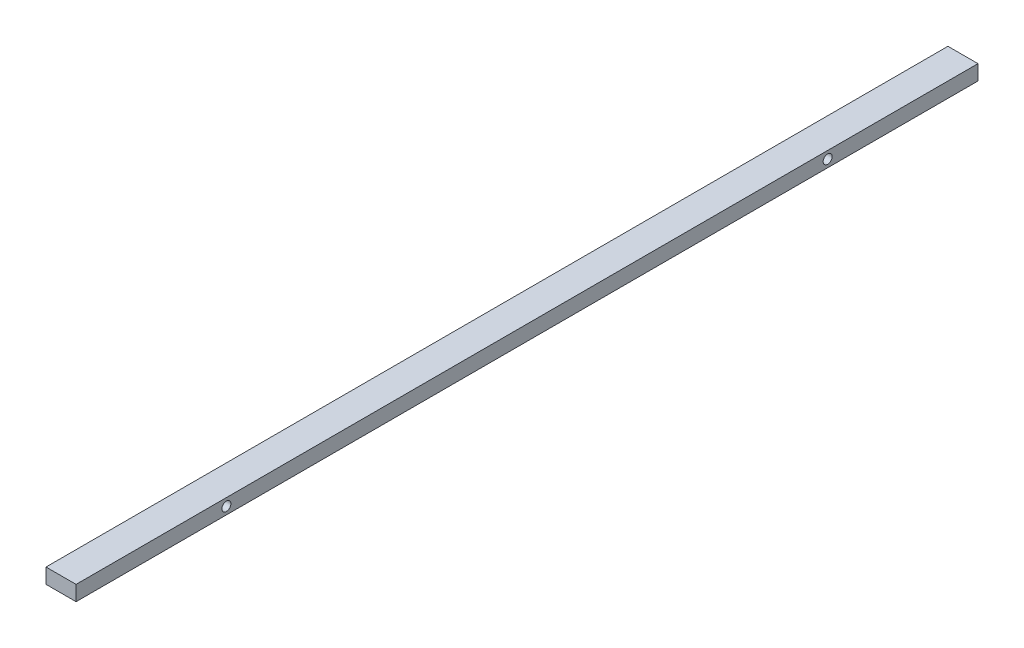
ISO-10303-21;
HEADER;
FILE_DESCRIPTION(('STEP AP214'),'2;1');
FILE_NAME('part.step','',(''),(''),'','','');
FILE_SCHEMA(('AUTOMOTIVE_DESIGN { 1 0 10303 214 1 1 1 1 }'));
ENDSEC;
DATA;
#1=APPLICATION_CONTEXT('core data for automotive mechanical design processes');
#2=APPLICATION_PROTOCOL_DEFINITION('international standard','automotive_design',2000,#1);
#3=PRODUCT_CONTEXT('',#1,'mechanical');
#4=PRODUCT('Part','Part','',(#3));
#5=PRODUCT_RELATED_PRODUCT_CATEGORY('part','',(#4));
#6=PRODUCT_DEFINITION_FORMATION('','',#4);
#7=PRODUCT_DEFINITION_CONTEXT('part definition',#1,'design');
#8=PRODUCT_DEFINITION('design','',#6,#7);
#9=PRODUCT_DEFINITION_SHAPE('','',#8);
#10=(LENGTH_UNIT() NAMED_UNIT(*) SI_UNIT(.MILLI.,.METRE.));
#11=(NAMED_UNIT(*) PLANE_ANGLE_UNIT() SI_UNIT($,.RADIAN.));
#12=(NAMED_UNIT(*) SI_UNIT($,.STERADIAN.) SOLID_ANGLE_UNIT());
#13=UNCERTAINTY_MEASURE_WITH_UNIT(LENGTH_MEASURE(1.E-05),#10,'distance_accuracy_value','');
#14=(GEOMETRIC_REPRESENTATION_CONTEXT(3) GLOBAL_UNCERTAINTY_ASSIGNED_CONTEXT((#13)) GLOBAL_UNIT_ASSIGNED_CONTEXT((#10,
#11,#12)) REPRESENTATION_CONTEXT('',''));
#15=CARTESIAN_POINT('',(0.,0.,0.));
#16=DIRECTION('',(0.,0.,1.));
#17=DIRECTION('',(1.,0.,0.));
#18=AXIS2_PLACEMENT_3D('',#15,#16,#17);
#19=CARTESIAN_POINT('',(-4.76793248945147,0.379746835443036,300.));
#20=DIRECTION('',(1.,0.,0.));
#21=DIRECTION('',(0.,1.,0.));
#22=AXIS2_PLACEMENT_3D('',#19,#20,#21);
#23=PLANE('',#22);
#24=CARTESIAN_POINT('',(-4.76793248945147,-2.12025316455696,50.));
#25=DIRECTION('',(1.,0.,0.));
#26=DIRECTION('',(0.,1.,0.));
#27=AXIS2_PLACEMENT_3D('',#24,#25,#26);
#28=CIRCLE('',#27,1.5);
#29=CARTESIAN_POINT('',(-4.76793248945147,-0.62025316455696,50.));
#30=VERTEX_POINT('',#29);
#31=EDGE_CURVE('E99',#30,#30,#28,.T.);
#32=ORIENTED_EDGE('',*,*,#31,.T.);
#33=EDGE_LOOP('',(#32));
#34=FACE_BOUND('',#33,.T.);
#35=CARTESIAN_POINT('',(-4.76793248945147,-2.12025316455697,250.));
#36=DIRECTION('',(1.,0.,0.));
#37=DIRECTION('',(0.,1.,0.));
#38=AXIS2_PLACEMENT_3D('',#35,#36,#37);
#39=CIRCLE('',#38,1.50000000000002);
#40=CARTESIAN_POINT('',(-4.76793248945147,-0.620253164556946,250.));
#41=VERTEX_POINT('',#40);
#42=EDGE_CURVE('E112',#41,#41,#39,.T.);
#43=ORIENTED_EDGE('',*,*,#42,.T.);
#44=EDGE_LOOP('',(#43));
#45=FACE_BOUND('',#44,.T.);
#46=DIRECTION('',(0.,-1.,0.));
#47=VECTOR('',#46,1.);
#48=CARTESIAN_POINT('',(-4.76793248945147,0.379746835443036,0.));
#49=LINE('',#48,#47);
#50=CARTESIAN_POINT('',(-4.76793248945147,0.379746835443036,0.));
#51=VERTEX_POINT('',#50);
#52=CARTESIAN_POINT('',(-4.76793248945147,-4.62025316455696,0.));
#53=VERTEX_POINT('',#52);
#54=EDGE_CURVE('E96',#51,#53,#49,.T.);
#55=ORIENTED_EDGE('',*,*,#54,.T.);
#56=DIRECTION('',(0.,0.,-1.));
#57=VECTOR('',#56,1.);
#58=CARTESIAN_POINT('',(-4.76793248945147,-4.62025316455696,300.));
#59=LINE('',#58,#57);
#60=CARTESIAN_POINT('',(-4.76793248945147,-4.62025316455696,300.));
#61=VERTEX_POINT('',#60);
#62=EDGE_CURVE('E11',#61,#53,#59,.T.);
#63=ORIENTED_EDGE('',*,*,#62,.F.);
#64=DIRECTION('',(0.,-1.,0.));
#65=VECTOR('',#64,1.);
#66=CARTESIAN_POINT('',(-4.76793248945147,0.379746835443036,300.));
#67=LINE('',#66,#65);
#68=CARTESIAN_POINT('',(-4.76793248945147,0.379746835443036,300.));
#69=VERTEX_POINT('',#68);
#70=EDGE_CURVE('E84',#69,#61,#67,.T.);
#71=ORIENTED_EDGE('',*,*,#70,.F.);
#72=DIRECTION('',(0.,0.,-1.));
#73=VECTOR('',#72,1.);
#74=CARTESIAN_POINT('',(-4.76793248945147,0.379746835443036,300.));
#75=LINE('',#74,#73);
#76=EDGE_CURVE('E92',#69,#51,#75,.T.);
#77=ORIENTED_EDGE('',*,*,#76,.T.);
#78=EDGE_LOOP('',(#55,#63,#71,#77));
#79=FACE_BOUND('',#78,.T.);
#80=ADVANCED_FACE('F33',(#34,#45,#79),#23,.F.);
#81=CARTESIAN_POINT('',(-4.76793248945147,-4.62025316455696,300.));
#82=DIRECTION('',(0.,1.,0.));
#83=DIRECTION('',(0.,0.,1.));
#84=AXIS2_PLACEMENT_3D('',#81,#82,#83);
#85=PLANE('',#84);
#86=DIRECTION('',(1.,0.,0.));
#87=VECTOR('',#86,1.);
#88=CARTESIAN_POINT('',(-4.76793248945147,-4.62025316455696,0.));
#89=LINE('',#88,#87);
#90=CARTESIAN_POINT('',(5.23206751054853,-4.62025316455696,0.));
#91=VERTEX_POINT('',#90);
#92=EDGE_CURVE('E88',#53,#91,#89,.T.);
#93=ORIENTED_EDGE('',*,*,#92,.T.);
#94=DIRECTION('',(0.,0.,-1.));
#95=VECTOR('',#94,1.);
#96=CARTESIAN_POINT('',(5.23206751054853,-4.62025316455696,300.));
#97=LINE('',#96,#95);
#98=CARTESIAN_POINT('',(5.23206751054853,-4.62025316455696,300.));
#99=VERTEX_POINT('',#98);
#100=EDGE_CURVE('E41',#99,#91,#97,.T.);
#101=ORIENTED_EDGE('',*,*,#100,.F.);
#102=DIRECTION('',(1.,0.,0.));
#103=VECTOR('',#102,1.);
#104=CARTESIAN_POINT('',(-4.76793248945147,-4.62025316455696,300.));
#105=LINE('',#104,#103);
#106=EDGE_CURVE('E79',#61,#99,#105,.T.);
#107=ORIENTED_EDGE('',*,*,#106,.F.);
#108=ORIENTED_EDGE('',*,*,#62,.T.);
#109=EDGE_LOOP('',(#93,#101,#107,#108));
#110=FACE_BOUND('',#109,.T.);
#111=ADVANCED_FACE('F87',(#110),#85,.F.);
#112=CARTESIAN_POINT('',(5.23206751054853,0.379746835443036,300.));
#113=DIRECTION('',(-1.,0.,0.));
#114=DIRECTION('',(0.,-1.,0.));
#115=AXIS2_PLACEMENT_3D('',#112,#113,#114);
#116=PLANE('',#115);
#117=CARTESIAN_POINT('',(5.23206751054853,-2.12025316455696,50.));
#118=DIRECTION('',(-1.,0.,0.));
#119=DIRECTION('',(0.,-1.,0.));
#120=AXIS2_PLACEMENT_3D('',#117,#118,#119);
#121=CIRCLE('',#120,1.5);
#122=CARTESIAN_POINT('',(5.23206751054853,-3.62025316455696,50.));
#123=VERTEX_POINT('',#122);
#124=EDGE_CURVE('E115',#123,#123,#121,.T.);
#125=ORIENTED_EDGE('',*,*,#124,.T.);
#126=EDGE_LOOP('',(#125));
#127=FACE_BOUND('',#126,.T.);
#128=CARTESIAN_POINT('',(5.23206751054853,-2.12025316455697,250.));
#129=DIRECTION('',(-1.,0.,0.));
#130=DIRECTION('',(0.,-1.,0.));
#131=AXIS2_PLACEMENT_3D('',#128,#129,#130);
#132=CIRCLE('',#131,1.50000000000002);
#133=CARTESIAN_POINT('',(5.23206751054853,-3.62025316455699,250.));
#134=VERTEX_POINT('',#133);
#135=EDGE_CURVE('E116',#134,#134,#132,.T.);
#136=ORIENTED_EDGE('',*,*,#135,.T.);
#137=EDGE_LOOP('',(#136));
#138=FACE_BOUND('',#137,.T.);
#139=DIRECTION('',(0.,1.,0.));
#140=VECTOR('',#139,1.);
#141=CARTESIAN_POINT('',(5.23206751054853,0.379746835443036,0.));
#142=LINE('',#141,#140);
#143=CARTESIAN_POINT('',(5.23206751054853,0.379746835443036,0.));
#144=VERTEX_POINT('',#143);
#145=EDGE_CURVE('E66',#91,#144,#142,.T.);
#146=ORIENTED_EDGE('',*,*,#145,.T.);
#147=DIRECTION('',(0.,0.,-1.));
#148=VECTOR('',#147,1.);
#149=CARTESIAN_POINT('',(5.23206751054853,0.379746835443036,300.));
#150=LINE('',#149,#148);
#151=CARTESIAN_POINT('',(5.23206751054853,0.379746835443036,300.));
#152=VERTEX_POINT('',#151);
#153=EDGE_CURVE('E89',#152,#144,#150,.T.);
#154=ORIENTED_EDGE('',*,*,#153,.F.);
#155=DIRECTION('',(0.,1.,0.));
#156=VECTOR('',#155,1.);
#157=CARTESIAN_POINT('',(5.23206751054853,0.379746835443036,300.));
#158=LINE('',#157,#156);
#159=EDGE_CURVE('E82',#99,#152,#158,.T.);
#160=ORIENTED_EDGE('',*,*,#159,.F.);
#161=ORIENTED_EDGE('',*,*,#100,.T.);
#162=EDGE_LOOP('',(#146,#154,#160,#161));
#163=FACE_BOUND('',#162,.T.);
#164=ADVANCED_FACE('F90',(#127,#138,#163),#116,.F.);
#165=CARTESIAN_POINT('',(-4.76793248945147,0.379746835443036,300.));
#166=DIRECTION('',(0.,-1.,0.));
#167=DIRECTION('',(0.,0.,-1.));
#168=AXIS2_PLACEMENT_3D('',#165,#166,#167);
#169=PLANE('',#168);
#170=DIRECTION('',(-1.,0.,0.));
#171=VECTOR('',#170,1.);
#172=CARTESIAN_POINT('',(-4.76793248945147,0.379746835443036,0.));
#173=LINE('',#172,#171);
#174=EDGE_CURVE('E72',#144,#51,#173,.T.);
#175=ORIENTED_EDGE('',*,*,#174,.T.);
#176=ORIENTED_EDGE('',*,*,#76,.F.);
#177=DIRECTION('',(-1.,0.,0.));
#178=VECTOR('',#177,1.);
#179=CARTESIAN_POINT('',(-4.76793248945147,0.379746835443036,300.));
#180=LINE('',#179,#178);
#181=EDGE_CURVE('E49',#152,#69,#180,.T.);
#182=ORIENTED_EDGE('',*,*,#181,.F.);
#183=ORIENTED_EDGE('',*,*,#153,.T.);
#184=EDGE_LOOP('',(#175,#176,#182,#183));
#185=FACE_BOUND('',#184,.T.);
#186=ADVANCED_FACE('F104',(#185),#169,.F.);
#187=CARTESIAN_POINT('',(0.,0.,300.));
#188=DIRECTION('',(0.,0.,1.));
#189=DIRECTION('',(1.,0.,0.));
#190=AXIS2_PLACEMENT_3D('',#187,#188,#189);
#191=PLANE('',#190);
#192=ORIENTED_EDGE('',*,*,#70,.T.);
#193=ORIENTED_EDGE('',*,*,#106,.T.);
#194=ORIENTED_EDGE('',*,*,#159,.T.);
#195=ORIENTED_EDGE('',*,*,#181,.T.);
#196=EDGE_LOOP('',(#192,#193,#194,#195));
#197=FACE_BOUND('',#196,.T.);
#198=ADVANCED_FACE('F80',(#197),#191,.T.);
#199=CARTESIAN_POINT('',(0.,0.,0.));
#200=DIRECTION('',(0.,0.,1.));
#201=DIRECTION('',(1.,0.,0.));
#202=AXIS2_PLACEMENT_3D('',#199,#200,#201);
#203=PLANE('',#202);
#204=ORIENTED_EDGE('',*,*,#54,.F.);
#205=ORIENTED_EDGE('',*,*,#174,.F.);
#206=ORIENTED_EDGE('',*,*,#145,.F.);
#207=ORIENTED_EDGE('',*,*,#92,.F.);
#208=EDGE_LOOP('',(#204,#205,#206,#207));
#209=FACE_BOUND('',#208,.T.);
#210=ADVANCED_FACE('F107',(#209),#203,.F.);
#211=CARTESIAN_POINT('',(5.23206751054853,-2.12025316455697,250.));
#212=DIRECTION('',(-1.,0.,0.));
#213=DIRECTION('',(0.,-1.,0.));
#214=AXIS2_PLACEMENT_3D('',#211,#212,#213);
#215=CYLINDRICAL_SURFACE('',#214,1.50000000000002);
#216=ORIENTED_EDGE('',*,*,#135,.F.);
#217=EDGE_LOOP('',(#216));
#218=FACE_BOUND('',#217,.T.);
#219=ORIENTED_EDGE('',*,*,#42,.F.);
#220=EDGE_LOOP('',(#219));
#221=FACE_BOUND('',#220,.T.);
#222=ADVANCED_FACE('F127',(#218,#221),#215,.F.);
#223=CARTESIAN_POINT('',(5.23206751054853,-2.12025316455696,50.));
#224=DIRECTION('',(-1.,0.,0.));
#225=DIRECTION('',(0.,-1.,0.));
#226=AXIS2_PLACEMENT_3D('',#223,#224,#225);
#227=CYLINDRICAL_SURFACE('',#226,1.5);
#228=ORIENTED_EDGE('',*,*,#124,.F.);
#229=EDGE_LOOP('',(#228));
#230=FACE_BOUND('',#229,.T.);
#231=ORIENTED_EDGE('',*,*,#31,.F.);
#232=EDGE_LOOP('',(#231));
#233=FACE_BOUND('',#232,.T.);
#234=ADVANCED_FACE('F124',(#230,#233),#227,.F.);
#235=CLOSED_SHELL('',(#80,#111,#164,#186,#198,#210,#222,#234));
#236=MANIFOLD_SOLID_BREP('B2',#235);
#237=ADVANCED_BREP_SHAPE_REPRESENTATION('',(#18,#236),#14);
#238=SHAPE_DEFINITION_REPRESENTATION(#9,#237);
ENDSEC;
END-ISO-10303-21;
